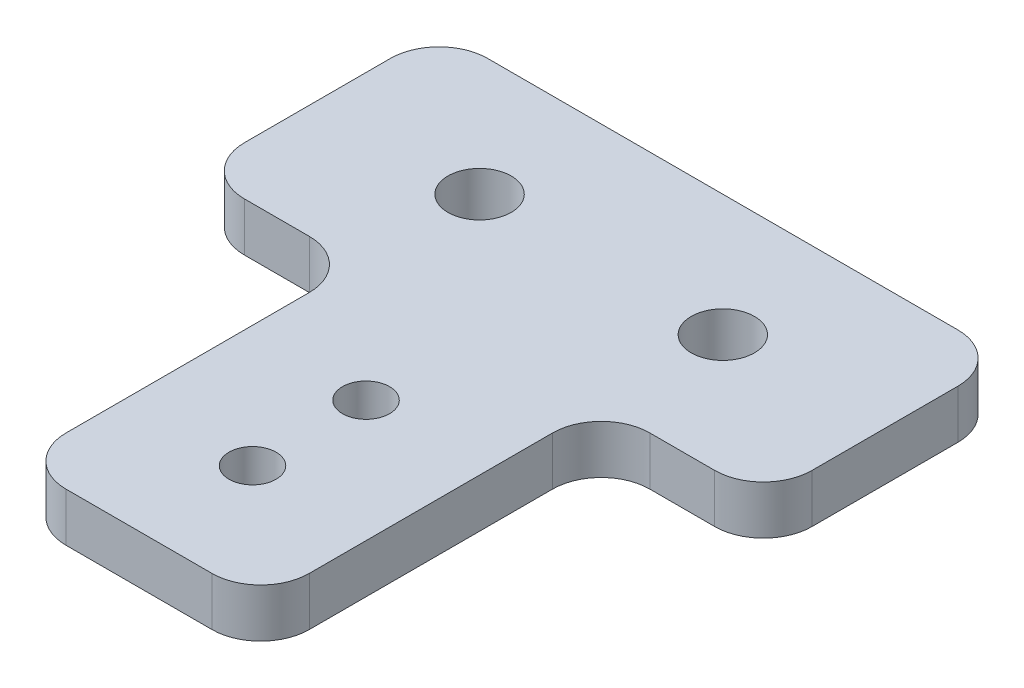
ISO-10303-21;
HEADER;
FILE_DESCRIPTION(('STEP AP214'),'2;1');
FILE_NAME('part.step','',(''),(''),'','','');
FILE_SCHEMA(('AUTOMOTIVE_DESIGN { 1 0 10303 214 1 1 1 1 }'));
ENDSEC;
DATA;
#1=APPLICATION_CONTEXT('core data for automotive mechanical design processes');
#2=APPLICATION_PROTOCOL_DEFINITION('international standard','automotive_design',2000,#1);
#3=PRODUCT_CONTEXT('',#1,'mechanical');
#4=PRODUCT('Part','Part','',(#3));
#5=PRODUCT_RELATED_PRODUCT_CATEGORY('part','',(#4));
#6=PRODUCT_DEFINITION_FORMATION('','',#4);
#7=PRODUCT_DEFINITION_CONTEXT('part definition',#1,'design');
#8=PRODUCT_DEFINITION('design','',#6,#7);
#9=PRODUCT_DEFINITION_SHAPE('','',#8);
#10=(LENGTH_UNIT() NAMED_UNIT(*) SI_UNIT(.MILLI.,.METRE.));
#11=(NAMED_UNIT(*) PLANE_ANGLE_UNIT() SI_UNIT($,.RADIAN.));
#12=(NAMED_UNIT(*) SI_UNIT($,.STERADIAN.) SOLID_ANGLE_UNIT());
#13=UNCERTAINTY_MEASURE_WITH_UNIT(LENGTH_MEASURE(1.E-05),#10,'distance_accuracy_value','');
#14=(GEOMETRIC_REPRESENTATION_CONTEXT(3) GLOBAL_UNCERTAINTY_ASSIGNED_CONTEXT((#13)) GLOBAL_UNIT_ASSIGNED_CONTEXT((#10,
#11,#12)) REPRESENTATION_CONTEXT('',''));
#15=CARTESIAN_POINT('',(0.,0.,0.));
#16=DIRECTION('',(0.,0.,1.));
#17=DIRECTION('',(1.,0.,0.));
#18=AXIS2_PLACEMENT_3D('',#15,#16,#17);
#19=CARTESIAN_POINT('',(0.,3.,0.));
#20=DIRECTION('',(0.,-1.,0.));
#21=DIRECTION('',(0.,0.,-1.));
#22=AXIS2_PLACEMENT_3D('',#19,#20,#21);
#23=PLANE('',#22);
#24=DIRECTION('',(1.,0.,0.));
#25=VECTOR('',#24,1.);
#26=CARTESIAN_POINT('',(-7.49999999999999,3.,28.5));
#27=LINE('',#26,#25);
#28=CARTESIAN_POINT('',(-4.49999999999999,3.,28.5));
#29=VERTEX_POINT('',#28);
#30=CARTESIAN_POINT('',(4.50000000000001,3.,28.5));
#31=VERTEX_POINT('',#30);
#32=EDGE_CURVE('E264',#29,#31,#27,.T.);
#33=ORIENTED_EDGE('',*,*,#32,.T.);
#34=CARTESIAN_POINT('',(4.5,3.,25.5));
#35=DIRECTION('',(0.,-1.,0.));
#36=DIRECTION('',(0.,0.,-1.));
#37=AXIS2_PLACEMENT_3D('',#34,#35,#36);
#38=CIRCLE('',#37,3.);
#39=CARTESIAN_POINT('',(7.50000000000001,3.,25.5));
#40=VERTEX_POINT('',#39);
#41=EDGE_CURVE('E212',#31,#40,#38,.F.);
#42=ORIENTED_EDGE('',*,*,#41,.T.);
#43=DIRECTION('',(0.,0.,-1.));
#44=VECTOR('',#43,1.);
#45=CARTESIAN_POINT('',(7.5,3.,7.5));
#46=LINE('',#45,#44);
#47=CARTESIAN_POINT('',(7.5,3.,10.5));
#48=VERTEX_POINT('',#47);
#49=EDGE_CURVE('E173',#40,#48,#46,.T.);
#50=ORIENTED_EDGE('',*,*,#49,.T.);
#51=CARTESIAN_POINT('',(10.5,3.,10.5));
#52=DIRECTION('',(0.,-1.,0.));
#53=DIRECTION('',(0.,0.,-1.));
#54=AXIS2_PLACEMENT_3D('',#51,#52,#53);
#55=CIRCLE('',#54,3.);
#56=CARTESIAN_POINT('',(10.5,3.,7.5));
#57=VERTEX_POINT('',#56);
#58=EDGE_CURVE('E11',#48,#57,#55,.T.);
#59=ORIENTED_EDGE('',*,*,#58,.T.);
#60=DIRECTION('',(1.,0.,0.));
#61=VECTOR('',#60,1.);
#62=CARTESIAN_POINT('',(7.5,3.,7.5));
#63=LINE('',#62,#61);
#64=CARTESIAN_POINT('',(14.5,3.,7.5));
#65=VERTEX_POINT('',#64);
#66=EDGE_CURVE('E189',#57,#65,#63,.T.);
#67=ORIENTED_EDGE('',*,*,#66,.T.);
#68=CARTESIAN_POINT('',(14.5,3.,4.5));
#69=DIRECTION('',(0.,-1.,0.));
#70=DIRECTION('',(0.,0.,-1.));
#71=AXIS2_PLACEMENT_3D('',#68,#69,#70);
#72=CIRCLE('',#71,3.);
#73=CARTESIAN_POINT('',(17.5,3.,4.5));
#74=VERTEX_POINT('',#73);
#75=EDGE_CURVE('E202',#65,#74,#72,.F.);
#76=ORIENTED_EDGE('',*,*,#75,.T.);
#77=DIRECTION('',(0.,0.,-1.));
#78=VECTOR('',#77,1.);
#79=CARTESIAN_POINT('',(17.5,3.,7.5));
#80=LINE('',#79,#78);
#81=CARTESIAN_POINT('',(17.5,3.,-4.49999999999999));
#82=VERTEX_POINT('',#81);
#83=EDGE_CURVE('E183',#74,#82,#80,.T.);
#84=ORIENTED_EDGE('',*,*,#83,.T.);
#85=CARTESIAN_POINT('',(14.5,3.,-4.5));
#86=DIRECTION('',(0.,-1.,0.));
#87=DIRECTION('',(0.,0.,-1.));
#88=AXIS2_PLACEMENT_3D('',#85,#86,#87);
#89=CIRCLE('',#88,3.);
#90=CARTESIAN_POINT('',(14.5,3.,-7.5));
#91=VERTEX_POINT('',#90);
#92=EDGE_CURVE('E204',#82,#91,#89,.F.);
#93=ORIENTED_EDGE('',*,*,#92,.T.);
#94=DIRECTION('',(-1.,0.,0.));
#95=VECTOR('',#94,1.);
#96=CARTESIAN_POINT('',(-17.5,3.,-7.5));
#97=LINE('',#96,#95);
#98=CARTESIAN_POINT('',(-14.5,3.,-7.5));
#99=VERTEX_POINT('',#98);
#100=EDGE_CURVE('E292',#91,#99,#97,.T.);
#101=ORIENTED_EDGE('',*,*,#100,.T.);
#102=CARTESIAN_POINT('',(-14.5,3.,-4.5));
#103=DIRECTION('',(0.,-1.,0.));
#104=DIRECTION('',(0.,0.,-1.));
#105=AXIS2_PLACEMENT_3D('',#102,#103,#104);
#106=CIRCLE('',#105,3.);
#107=CARTESIAN_POINT('',(-17.5,3.,-4.49999999999999));
#108=VERTEX_POINT('',#107);
#109=EDGE_CURVE('E206',#99,#108,#106,.F.);
#110=ORIENTED_EDGE('',*,*,#109,.T.);
#111=DIRECTION('',(0.,0.,1.));
#112=VECTOR('',#111,1.);
#113=CARTESIAN_POINT('',(-17.5,3.,7.5));
#114=LINE('',#113,#112);
#115=CARTESIAN_POINT('',(-17.5,3.,4.5));
#116=VERTEX_POINT('',#115);
#117=EDGE_CURVE('E289',#108,#116,#114,.T.);
#118=ORIENTED_EDGE('',*,*,#117,.T.);
#119=CARTESIAN_POINT('',(-14.5,3.,4.5));
#120=DIRECTION('',(0.,-1.,0.));
#121=DIRECTION('',(0.,0.,-1.));
#122=AXIS2_PLACEMENT_3D('',#119,#120,#121);
#123=CIRCLE('',#122,3.);
#124=CARTESIAN_POINT('',(-14.5,3.,7.5));
#125=VERTEX_POINT('',#124);
#126=EDGE_CURVE('E208',#116,#125,#123,.F.);
#127=ORIENTED_EDGE('',*,*,#126,.T.);
#128=DIRECTION('',(1.,0.,0.));
#129=VECTOR('',#128,1.);
#130=CARTESIAN_POINT('',(-17.5,3.,7.5));
#131=LINE('',#130,#129);
#132=CARTESIAN_POINT('',(-10.5,3.,7.5));
#133=VERTEX_POINT('',#132);
#134=EDGE_CURVE('E255',#125,#133,#131,.T.);
#135=ORIENTED_EDGE('',*,*,#134,.T.);
#136=CARTESIAN_POINT('',(-10.5,3.,10.5));
#137=DIRECTION('',(0.,-1.,0.));
#138=DIRECTION('',(0.,0.,-1.));
#139=AXIS2_PLACEMENT_3D('',#136,#137,#138);
#140=CIRCLE('',#139,3.);
#141=CARTESIAN_POINT('',(-7.5,3.,10.5));
#142=VERTEX_POINT('',#141);
#143=EDGE_CURVE('E245',#133,#142,#140,.T.);
#144=ORIENTED_EDGE('',*,*,#143,.T.);
#145=DIRECTION('',(0.,0.,1.));
#146=VECTOR('',#145,1.);
#147=CARTESIAN_POINT('',(-7.5,3.,7.5));
#148=LINE('',#147,#146);
#149=CARTESIAN_POINT('',(-7.5,3.,25.5));
#150=VERTEX_POINT('',#149);
#151=EDGE_CURVE('E252',#142,#150,#148,.T.);
#152=ORIENTED_EDGE('',*,*,#151,.T.);
#153=CARTESIAN_POINT('',(-4.5,3.,25.5));
#154=DIRECTION('',(0.,-1.,0.));
#155=DIRECTION('',(0.,0.,-1.));
#156=AXIS2_PLACEMENT_3D('',#153,#154,#155);
#157=CIRCLE('',#156,3.);
#158=EDGE_CURVE('E210',#150,#29,#157,.F.);
#159=ORIENTED_EDGE('',*,*,#158,.T.);
#160=EDGE_LOOP('',(#33,#42,#50,#59,#67,#76,#84,#93,#101,#110,#118,#127,#135,#144,#152,#159));
#161=FACE_BOUND('',#160,.T.);
#162=CARTESIAN_POINT('',(0.,3.,14.5));
#163=DIRECTION('',(0.,1.,0.));
#164=DIRECTION('',(0.,0.,1.));
#165=AXIS2_PLACEMENT_3D('',#162,#163,#164);
#166=CIRCLE('',#165,1.45);
#167=CARTESIAN_POINT('',(0.,3.,15.95));
#168=VERTEX_POINT('',#167);
#169=EDGE_CURVE('E284',#168,#168,#166,.T.);
#170=ORIENTED_EDGE('',*,*,#169,.F.);
#171=EDGE_LOOP('',(#170));
#172=FACE_BOUND('',#171,.T.);
#173=CARTESIAN_POINT('',(0.,3.,21.5));
#174=DIRECTION('',(0.,1.,0.));
#175=DIRECTION('',(0.,0.,1.));
#176=AXIS2_PLACEMENT_3D('',#173,#174,#175);
#177=CIRCLE('',#176,1.45);
#178=CARTESIAN_POINT('',(0.,3.,22.95));
#179=VERTEX_POINT('',#178);
#180=EDGE_CURVE('E300',#179,#179,#177,.T.);
#181=ORIENTED_EDGE('',*,*,#180,.F.);
#182=EDGE_LOOP('',(#181));
#183=FACE_BOUND('',#182,.T.);
#184=CARTESIAN_POINT('',(-7.5,3.,0.));
#185=DIRECTION('',(0.,1.,0.));
#186=DIRECTION('',(0.,0.,1.));
#187=AXIS2_PLACEMENT_3D('',#184,#185,#186);
#188=CIRCLE('',#187,1.95);
#189=CARTESIAN_POINT('',(-7.5,3.,1.95));
#190=VERTEX_POINT('',#189);
#191=EDGE_CURVE('E306',#190,#190,#188,.T.);
#192=ORIENTED_EDGE('',*,*,#191,.F.);
#193=EDGE_LOOP('',(#192));
#194=FACE_BOUND('',#193,.T.);
#195=CARTESIAN_POINT('',(7.5,3.,0.));
#196=DIRECTION('',(0.,1.,0.));
#197=DIRECTION('',(0.,0.,-1.));
#198=AXIS2_PLACEMENT_3D('',#195,#196,#197);
#199=CIRCLE('',#198,1.95);
#200=CARTESIAN_POINT('',(7.5,3.,-1.95));
#201=VERTEX_POINT('',#200);
#202=EDGE_CURVE('E312',#201,#201,#199,.T.);
#203=ORIENTED_EDGE('',*,*,#202,.F.);
#204=EDGE_LOOP('',(#203));
#205=FACE_BOUND('',#204,.T.);
#206=ADVANCED_FACE('F41',(#161,#172,#183,#194,#205),#23,.F.);
#207=CARTESIAN_POINT('',(0.,0.,0.));
#208=DIRECTION('',(0.,-1.,0.));
#209=DIRECTION('',(0.,0.,-1.));
#210=AXIS2_PLACEMENT_3D('',#207,#208,#209);
#211=PLANE('',#210);
#212=CARTESIAN_POINT('',(-7.5,0.,0.));
#213=DIRECTION('',(0.,1.,0.));
#214=DIRECTION('',(0.,0.,1.));
#215=AXIS2_PLACEMENT_3D('',#212,#213,#214);
#216=CIRCLE('',#215,1.95);
#217=CARTESIAN_POINT('',(-7.5,0.,1.95));
#218=VERTEX_POINT('',#217);
#219=EDGE_CURVE('E309',#218,#218,#216,.T.);
#220=ORIENTED_EDGE('',*,*,#219,.T.);
#221=EDGE_LOOP('',(#220));
#222=FACE_BOUND('',#221,.T.);
#223=CARTESIAN_POINT('',(0.,0.,14.5));
#224=DIRECTION('',(0.,1.,0.));
#225=DIRECTION('',(0.,0.,1.));
#226=AXIS2_PLACEMENT_3D('',#223,#224,#225);
#227=CIRCLE('',#226,1.45);
#228=CARTESIAN_POINT('',(0.,0.,15.95));
#229=VERTEX_POINT('',#228);
#230=EDGE_CURVE('E297',#229,#229,#227,.T.);
#231=ORIENTED_EDGE('',*,*,#230,.T.);
#232=EDGE_LOOP('',(#231));
#233=FACE_BOUND('',#232,.T.);
#234=DIRECTION('',(0.,0.,-1.));
#235=VECTOR('',#234,1.);
#236=CARTESIAN_POINT('',(7.5,0.,7.5));
#237=LINE('',#236,#235);
#238=CARTESIAN_POINT('',(7.50000000000001,0.,25.5));
#239=VERTEX_POINT('',#238);
#240=CARTESIAN_POINT('',(7.5,0.,10.5));
#241=VERTEX_POINT('',#240);
#242=EDGE_CURVE('E171',#239,#241,#237,.T.);
#243=ORIENTED_EDGE('',*,*,#242,.F.);
#244=CARTESIAN_POINT('',(4.5,0.,25.5));
#245=DIRECTION('',(0.,-1.,0.));
#246=DIRECTION('',(0.,0.,-1.));
#247=AXIS2_PLACEMENT_3D('',#244,#245,#246);
#248=CIRCLE('',#247,3.);
#249=CARTESIAN_POINT('',(4.50000000000001,0.,28.5));
#250=VERTEX_POINT('',#249);
#251=EDGE_CURVE('E154',#239,#250,#248,.T.);
#252=ORIENTED_EDGE('',*,*,#251,.T.);
#253=DIRECTION('',(1.,0.,0.));
#254=VECTOR('',#253,1.);
#255=CARTESIAN_POINT('',(-7.49999999999999,0.,28.5));
#256=LINE('',#255,#254);
#257=CARTESIAN_POINT('',(-4.49999999999999,0.,28.5));
#258=VERTEX_POINT('',#257);
#259=EDGE_CURVE('E181',#258,#250,#256,.T.);
#260=ORIENTED_EDGE('',*,*,#259,.F.);
#261=CARTESIAN_POINT('',(-4.5,0.,25.5));
#262=DIRECTION('',(0.,-1.,0.));
#263=DIRECTION('',(0.,0.,-1.));
#264=AXIS2_PLACEMENT_3D('',#261,#262,#263);
#265=CIRCLE('',#264,3.);
#266=CARTESIAN_POINT('',(-7.5,0.,25.5));
#267=VERTEX_POINT('',#266);
#268=EDGE_CURVE('E165',#258,#267,#265,.T.);
#269=ORIENTED_EDGE('',*,*,#268,.T.);
#270=DIRECTION('',(0.,0.,1.));
#271=VECTOR('',#270,1.);
#272=CARTESIAN_POINT('',(-7.5,0.,7.5));
#273=LINE('',#272,#271);
#274=CARTESIAN_POINT('',(-7.5,0.,10.5));
#275=VERTEX_POINT('',#274);
#276=EDGE_CURVE('E185',#275,#267,#273,.T.);
#277=ORIENTED_EDGE('',*,*,#276,.F.);
#278=CARTESIAN_POINT('',(-10.5,0.,10.5));
#279=DIRECTION('',(0.,-1.,0.));
#280=DIRECTION('',(0.,0.,-1.));
#281=AXIS2_PLACEMENT_3D('',#278,#279,#280);
#282=CIRCLE('',#281,3.);
#283=CARTESIAN_POINT('',(-10.5,0.,7.5));
#284=VERTEX_POINT('',#283);
#285=EDGE_CURVE('E243',#275,#284,#282,.F.);
#286=ORIENTED_EDGE('',*,*,#285,.T.);
#287=DIRECTION('',(1.,0.,0.));
#288=VECTOR('',#287,1.);
#289=CARTESIAN_POINT('',(-17.5,0.,7.5));
#290=LINE('',#289,#288);
#291=CARTESIAN_POINT('',(-14.5,0.,7.5));
#292=VERTEX_POINT('',#291);
#293=EDGE_CURVE('E269',#292,#284,#290,.T.);
#294=ORIENTED_EDGE('',*,*,#293,.F.);
#295=CARTESIAN_POINT('',(-14.5,0.,4.5));
#296=DIRECTION('',(0.,-1.,0.));
#297=DIRECTION('',(0.,0.,-1.));
#298=AXIS2_PLACEMENT_3D('',#295,#296,#297);
#299=CIRCLE('',#298,3.);
#300=CARTESIAN_POINT('',(-17.5,0.,4.5));
#301=VERTEX_POINT('',#300);
#302=EDGE_CURVE('E196',#292,#301,#299,.T.);
#303=ORIENTED_EDGE('',*,*,#302,.T.);
#304=DIRECTION('',(0.,0.,1.));
#305=VECTOR('',#304,1.);
#306=CARTESIAN_POINT('',(-17.5,0.,7.5));
#307=LINE('',#306,#305);
#308=CARTESIAN_POINT('',(-17.5,0.,-4.49999999999999));
#309=VERTEX_POINT('',#308);
#310=EDGE_CURVE('E273',#309,#301,#307,.T.);
#311=ORIENTED_EDGE('',*,*,#310,.F.);
#312=CARTESIAN_POINT('',(-14.5,0.,-4.5));
#313=DIRECTION('',(0.,-1.,0.));
#314=DIRECTION('',(0.,0.,-1.));
#315=AXIS2_PLACEMENT_3D('',#312,#313,#314);
#316=CIRCLE('',#315,3.);
#317=CARTESIAN_POINT('',(-14.5,0.,-7.5));
#318=VERTEX_POINT('',#317);
#319=EDGE_CURVE('E194',#309,#318,#316,.T.);
#320=ORIENTED_EDGE('',*,*,#319,.T.);
#321=DIRECTION('',(-1.,0.,0.));
#322=VECTOR('',#321,1.);
#323=CARTESIAN_POINT('',(-17.5,0.,-7.5));
#324=LINE('',#323,#322);
#325=CARTESIAN_POINT('',(14.5,0.,-7.5));
#326=VERTEX_POINT('',#325);
#327=EDGE_CURVE('E276',#326,#318,#324,.T.);
#328=ORIENTED_EDGE('',*,*,#327,.F.);
#329=CARTESIAN_POINT('',(14.5,0.,-4.5));
#330=DIRECTION('',(0.,-1.,0.));
#331=DIRECTION('',(0.,0.,-1.));
#332=AXIS2_PLACEMENT_3D('',#329,#330,#331);
#333=CIRCLE('',#332,3.);
#334=CARTESIAN_POINT('',(17.5,0.,-4.49999999999999));
#335=VERTEX_POINT('',#334);
#336=EDGE_CURVE('E192',#326,#335,#333,.T.);
#337=ORIENTED_EDGE('',*,*,#336,.T.);
#338=DIRECTION('',(0.,0.,-1.));
#339=VECTOR('',#338,1.);
#340=CARTESIAN_POINT('',(17.5,0.,7.5));
#341=LINE('',#340,#339);
#342=CARTESIAN_POINT('',(17.5,0.,4.5));
#343=VERTEX_POINT('',#342);
#344=EDGE_CURVE('E281',#343,#335,#341,.T.);
#345=ORIENTED_EDGE('',*,*,#344,.F.);
#346=CARTESIAN_POINT('',(14.5,0.,4.5));
#347=DIRECTION('',(0.,-1.,0.));
#348=DIRECTION('',(0.,0.,-1.));
#349=AXIS2_PLACEMENT_3D('',#346,#347,#348);
#350=CIRCLE('',#349,3.);
#351=CARTESIAN_POINT('',(14.5,0.,7.5));
#352=VERTEX_POINT('',#351);
#353=EDGE_CURVE('E174',#343,#352,#350,.T.);
#354=ORIENTED_EDGE('',*,*,#353,.T.);
#355=DIRECTION('',(1.,0.,0.));
#356=VECTOR('',#355,1.);
#357=CARTESIAN_POINT('',(7.5,0.,7.5));
#358=LINE('',#357,#356);
#359=CARTESIAN_POINT('',(10.5,0.,7.5));
#360=VERTEX_POINT('',#359);
#361=EDGE_CURVE('E180',#360,#352,#358,.T.);
#362=ORIENTED_EDGE('',*,*,#361,.F.);
#363=CARTESIAN_POINT('',(10.5,0.,10.5));
#364=DIRECTION('',(0.,-1.,0.));
#365=DIRECTION('',(0.,0.,-1.));
#366=AXIS2_PLACEMENT_3D('',#363,#364,#365);
#367=CIRCLE('',#366,3.);
#368=EDGE_CURVE('E49',#360,#241,#367,.F.);
#369=ORIENTED_EDGE('',*,*,#368,.T.);
#370=EDGE_LOOP('',(#243,#252,#260,#269,#277,#286,#294,#303,#311,#320,#328,#337,#345,#354,#362,#369));
#371=FACE_BOUND('',#370,.T.);
#372=CARTESIAN_POINT('',(0.,0.,21.5));
#373=DIRECTION('',(0.,1.,0.));
#374=DIRECTION('',(0.,0.,1.));
#375=AXIS2_PLACEMENT_3D('',#372,#373,#374);
#376=CIRCLE('',#375,1.45);
#377=CARTESIAN_POINT('',(0.,0.,22.95));
#378=VERTEX_POINT('',#377);
#379=EDGE_CURVE('E303',#378,#378,#376,.T.);
#380=ORIENTED_EDGE('',*,*,#379,.T.);
#381=EDGE_LOOP('',(#380));
#382=FACE_BOUND('',#381,.T.);
#383=CARTESIAN_POINT('',(7.5,0.,0.));
#384=DIRECTION('',(0.,1.,0.));
#385=DIRECTION('',(0.,0.,-1.));
#386=AXIS2_PLACEMENT_3D('',#383,#384,#385);
#387=CIRCLE('',#386,1.95);
#388=CARTESIAN_POINT('',(7.5,0.,-1.95));
#389=VERTEX_POINT('',#388);
#390=EDGE_CURVE('E315',#389,#389,#387,.T.);
#391=ORIENTED_EDGE('',*,*,#390,.T.);
#392=EDGE_LOOP('',(#391));
#393=FACE_BOUND('',#392,.T.);
#394=ADVANCED_FACE('F177',(#222,#233,#371,#382,#393),#211,.T.);
#395=CARTESIAN_POINT('',(17.5,3.,7.5));
#396=DIRECTION('',(-1.,0.,0.));
#397=DIRECTION('',(0.,0.,1.));
#398=AXIS2_PLACEMENT_3D('',#395,#396,#397);
#399=PLANE('',#398);
#400=ORIENTED_EDGE('',*,*,#344,.T.);
#401=DIRECTION('',(0.,-1.,0.));
#402=VECTOR('',#401,1.);
#403=CARTESIAN_POINT('',(17.5,3.,-4.5));
#404=LINE('',#403,#402);
#405=EDGE_CURVE('E237',#335,#82,#404,.F.);
#406=ORIENTED_EDGE('',*,*,#405,.T.);
#407=ORIENTED_EDGE('',*,*,#83,.F.);
#408=DIRECTION('',(0.,-1.,0.));
#409=VECTOR('',#408,1.);
#410=CARTESIAN_POINT('',(17.5,3.,4.5));
#411=LINE('',#410,#409);
#412=EDGE_CURVE('E234',#74,#343,#411,.T.);
#413=ORIENTED_EDGE('',*,*,#412,.T.);
#414=EDGE_LOOP('',(#400,#406,#407,#413));
#415=FACE_BOUND('',#414,.T.);
#416=ADVANCED_FACE('F330',(#415),#399,.F.);
#417=CARTESIAN_POINT('',(-17.5,3.,-7.5));
#418=DIRECTION('',(0.,0.,1.));
#419=DIRECTION('',(1.,0.,0.));
#420=AXIS2_PLACEMENT_3D('',#417,#418,#419);
#421=PLANE('',#420);
#422=ORIENTED_EDGE('',*,*,#327,.T.);
#423=DIRECTION('',(0.,-1.,0.));
#424=VECTOR('',#423,1.);
#425=CARTESIAN_POINT('',(-14.5,3.,-7.5));
#426=LINE('',#425,#424);
#427=EDGE_CURVE('E232',#318,#99,#426,.F.);
#428=ORIENTED_EDGE('',*,*,#427,.T.);
#429=ORIENTED_EDGE('',*,*,#100,.F.);
#430=DIRECTION('',(0.,-1.,0.));
#431=VECTOR('',#430,1.);
#432=CARTESIAN_POINT('',(14.5,3.,-7.5));
#433=LINE('',#432,#431);
#434=EDGE_CURVE('E229',#91,#326,#433,.T.);
#435=ORIENTED_EDGE('',*,*,#434,.T.);
#436=EDGE_LOOP('',(#422,#428,#429,#435));
#437=FACE_BOUND('',#436,.T.);
#438=ADVANCED_FACE('F353',(#437),#421,.F.);
#439=CARTESIAN_POINT('',(-17.5,3.,7.5));
#440=DIRECTION('',(1.,0.,0.));
#441=DIRECTION('',(0.,0.,-1.));
#442=AXIS2_PLACEMENT_3D('',#439,#440,#441);
#443=PLANE('',#442);
#444=ORIENTED_EDGE('',*,*,#310,.T.);
#445=DIRECTION('',(0.,-1.,0.));
#446=VECTOR('',#445,1.);
#447=CARTESIAN_POINT('',(-17.5,3.,4.5));
#448=LINE('',#447,#446);
#449=EDGE_CURVE('E227',#301,#116,#448,.F.);
#450=ORIENTED_EDGE('',*,*,#449,.T.);
#451=ORIENTED_EDGE('',*,*,#117,.F.);
#452=DIRECTION('',(0.,-1.,0.));
#453=VECTOR('',#452,1.);
#454=CARTESIAN_POINT('',(-17.5,3.,-4.5));
#455=LINE('',#454,#453);
#456=EDGE_CURVE('E224',#108,#309,#455,.T.);
#457=ORIENTED_EDGE('',*,*,#456,.T.);
#458=EDGE_LOOP('',(#444,#450,#451,#457));
#459=FACE_BOUND('',#458,.T.);
#460=ADVANCED_FACE('F350',(#459),#443,.F.);
#461=CARTESIAN_POINT('',(-17.5,3.,7.5));
#462=DIRECTION('',(0.,0.,-1.));
#463=DIRECTION('',(-1.,0.,0.));
#464=AXIS2_PLACEMENT_3D('',#461,#462,#463);
#465=PLANE('',#464);
#466=ORIENTED_EDGE('',*,*,#293,.T.);
#467=DIRECTION('',(0.,-1.,0.));
#468=VECTOR('',#467,1.);
#469=CARTESIAN_POINT('',(-10.5,3.,7.5));
#470=LINE('',#469,#468);
#471=EDGE_CURVE('E222',#284,#133,#470,.F.);
#472=ORIENTED_EDGE('',*,*,#471,.T.);
#473=ORIENTED_EDGE('',*,*,#134,.F.);
#474=DIRECTION('',(0.,-1.,0.));
#475=VECTOR('',#474,1.);
#476=CARTESIAN_POINT('',(-14.5,3.,7.5));
#477=LINE('',#476,#475);
#478=EDGE_CURVE('E219',#125,#292,#477,.T.);
#479=ORIENTED_EDGE('',*,*,#478,.T.);
#480=EDGE_LOOP('',(#466,#472,#473,#479));
#481=FACE_BOUND('',#480,.T.);
#482=ADVANCED_FACE('F271',(#481),#465,.F.);
#483=CARTESIAN_POINT('',(-7.5,3.,7.5));
#484=DIRECTION('',(1.,0.,0.));
#485=DIRECTION('',(0.,0.,-1.));
#486=AXIS2_PLACEMENT_3D('',#483,#484,#485);
#487=PLANE('',#486);
#488=ORIENTED_EDGE('',*,*,#276,.T.);
#489=DIRECTION('',(0.,-1.,0.));
#490=VECTOR('',#489,1.);
#491=CARTESIAN_POINT('',(-7.5,3.,25.5));
#492=LINE('',#491,#490);
#493=EDGE_CURVE('E217',#267,#150,#492,.F.);
#494=ORIENTED_EDGE('',*,*,#493,.T.);
#495=ORIENTED_EDGE('',*,*,#151,.F.);
#496=DIRECTION('',(0.,-1.,0.));
#497=VECTOR('',#496,1.);
#498=CARTESIAN_POINT('',(-7.5,0.,10.5));
#499=LINE('',#498,#497);
#500=EDGE_CURVE('E214',#142,#275,#499,.T.);
#501=ORIENTED_EDGE('',*,*,#500,.T.);
#502=EDGE_LOOP('',(#488,#494,#495,#501));
#503=FACE_BOUND('',#502,.T.);
#504=ADVANCED_FACE('F261',(#503),#487,.F.);
#505=CARTESIAN_POINT('',(-7.49999999999999,3.,28.5));
#506=DIRECTION('',(0.,0.,-1.));
#507=DIRECTION('',(-1.,0.,0.));
#508=AXIS2_PLACEMENT_3D('',#505,#506,#507);
#509=PLANE('',#508);
#510=ORIENTED_EDGE('',*,*,#259,.T.);
#511=DIRECTION('',(0.,-1.,0.));
#512=VECTOR('',#511,1.);
#513=CARTESIAN_POINT('',(4.50000000000001,3.,28.5));
#514=LINE('',#513,#512);
#515=EDGE_CURVE('E159',#250,#31,#514,.F.);
#516=ORIENTED_EDGE('',*,*,#515,.T.);
#517=ORIENTED_EDGE('',*,*,#32,.F.);
#518=DIRECTION('',(0.,-1.,0.));
#519=VECTOR('',#518,1.);
#520=CARTESIAN_POINT('',(-4.49999999999999,3.,28.5));
#521=LINE('',#520,#519);
#522=EDGE_CURVE('E164',#29,#258,#521,.T.);
#523=ORIENTED_EDGE('',*,*,#522,.T.);
#524=EDGE_LOOP('',(#510,#516,#517,#523));
#525=FACE_BOUND('',#524,.T.);
#526=ADVANCED_FACE('F342',(#525),#509,.F.);
#527=CARTESIAN_POINT('',(7.5,3.,7.5));
#528=DIRECTION('',(-1.,0.,0.));
#529=DIRECTION('',(0.,0.,1.));
#530=AXIS2_PLACEMENT_3D('',#527,#528,#529);
#531=PLANE('',#530);
#532=ORIENTED_EDGE('',*,*,#49,.F.);
#533=DIRECTION('',(0.,-1.,0.));
#534=VECTOR('',#533,1.);
#535=CARTESIAN_POINT('',(7.50000000000001,3.,25.5));
#536=LINE('',#535,#534);
#537=EDGE_CURVE('E158',#40,#239,#536,.T.);
#538=ORIENTED_EDGE('',*,*,#537,.T.);
#539=ORIENTED_EDGE('',*,*,#242,.T.);
#540=DIRECTION('',(0.,-1.,0.));
#541=VECTOR('',#540,1.);
#542=CARTESIAN_POINT('',(7.5,3.,10.5));
#543=LINE('',#542,#541);
#544=EDGE_CURVE('E175',#241,#48,#543,.F.);
#545=ORIENTED_EDGE('',*,*,#544,.T.);
#546=EDGE_LOOP('',(#532,#538,#539,#545));
#547=FACE_BOUND('',#546,.T.);
#548=ADVANCED_FACE('F170',(#547),#531,.F.);
#549=CARTESIAN_POINT('',(7.5,3.,7.5));
#550=DIRECTION('',(0.,0.,-1.));
#551=DIRECTION('',(-1.,0.,0.));
#552=AXIS2_PLACEMENT_3D('',#549,#550,#551);
#553=PLANE('',#552);
#554=ORIENTED_EDGE('',*,*,#361,.T.);
#555=DIRECTION('',(0.,-1.,0.));
#556=VECTOR('',#555,1.);
#557=CARTESIAN_POINT('',(14.5,3.,7.5));
#558=LINE('',#557,#556);
#559=EDGE_CURVE('E56',#352,#65,#558,.F.);
#560=ORIENTED_EDGE('',*,*,#559,.T.);
#561=ORIENTED_EDGE('',*,*,#66,.F.);
#562=DIRECTION('',(0.,-1.,0.));
#563=VECTOR('',#562,1.);
#564=CARTESIAN_POINT('',(10.5,0.,7.5));
#565=LINE('',#564,#563);
#566=EDGE_CURVE('E239',#57,#360,#565,.T.);
#567=ORIENTED_EDGE('',*,*,#566,.T.);
#568=EDGE_LOOP('',(#554,#560,#561,#567));
#569=FACE_BOUND('',#568,.T.);
#570=ADVANCED_FACE('F337',(#569),#553,.F.);
#571=CARTESIAN_POINT('',(0.,3.,14.5));
#572=DIRECTION('',(0.,-1.,0.));
#573=DIRECTION('',(0.,0.,-1.));
#574=AXIS2_PLACEMENT_3D('',#571,#572,#573);
#575=CYLINDRICAL_SURFACE('',#574,1.45);
#576=ORIENTED_EDGE('',*,*,#169,.T.);
#577=EDGE_LOOP('',(#576));
#578=FACE_BOUND('',#577,.T.);
#579=ORIENTED_EDGE('',*,*,#230,.F.);
#580=EDGE_LOOP('',(#579));
#581=FACE_BOUND('',#580,.T.);
#582=ADVANCED_FACE('F334',(#578,#581),#575,.F.);
#583=CARTESIAN_POINT('',(0.,3.,21.5));
#584=DIRECTION('',(0.,-1.,0.));
#585=DIRECTION('',(0.,0.,-1.));
#586=AXIS2_PLACEMENT_3D('',#583,#584,#585);
#587=CYLINDRICAL_SURFACE('',#586,1.45);
#588=ORIENTED_EDGE('',*,*,#180,.T.);
#589=EDGE_LOOP('',(#588));
#590=FACE_BOUND('',#589,.T.);
#591=ORIENTED_EDGE('',*,*,#379,.F.);
#592=EDGE_LOOP('',(#591));
#593=FACE_BOUND('',#592,.T.);
#594=ADVANCED_FACE('F466',(#590,#593),#587,.F.);
#595=CARTESIAN_POINT('',(-7.5,3.,0.));
#596=DIRECTION('',(0.,-1.,0.));
#597=DIRECTION('',(0.,0.,-1.));
#598=AXIS2_PLACEMENT_3D('',#595,#596,#597);
#599=CYLINDRICAL_SURFACE('',#598,1.95);
#600=ORIENTED_EDGE('',*,*,#191,.T.);
#601=EDGE_LOOP('',(#600));
#602=FACE_BOUND('',#601,.T.);
#603=ORIENTED_EDGE('',*,*,#219,.F.);
#604=EDGE_LOOP('',(#603));
#605=FACE_BOUND('',#604,.T.);
#606=ADVANCED_FACE('F457',(#602,#605),#599,.F.);
#607=CARTESIAN_POINT('',(7.5,3.,0.));
#608=DIRECTION('',(0.,-1.,0.));
#609=DIRECTION('',(0.,0.,-1.));
#610=AXIS2_PLACEMENT_3D('',#607,#608,#609);
#611=CYLINDRICAL_SURFACE('',#610,1.95);
#612=ORIENTED_EDGE('',*,*,#202,.T.);
#613=EDGE_LOOP('',(#612));
#614=FACE_BOUND('',#613,.T.);
#615=ORIENTED_EDGE('',*,*,#390,.F.);
#616=EDGE_LOOP('',(#615));
#617=FACE_BOUND('',#616,.T.);
#618=ADVANCED_FACE('F321',(#614,#617),#611,.F.);
#619=CARTESIAN_POINT('',(4.5,3.,25.5));
#620=DIRECTION('',(0.,-1.,0.));
#621=DIRECTION('',(0.,0.,-1.));
#622=AXIS2_PLACEMENT_3D('',#619,#620,#621);
#623=CYLINDRICAL_SURFACE('',#622,3.);
#624=ORIENTED_EDGE('',*,*,#41,.F.);
#625=ORIENTED_EDGE('',*,*,#515,.F.);
#626=ORIENTED_EDGE('',*,*,#251,.F.);
#627=ORIENTED_EDGE('',*,*,#537,.F.);
#628=EDGE_LOOP('',(#624,#625,#626,#627));
#629=FACE_BOUND('',#628,.T.);
#630=ADVANCED_FACE('F157',(#629),#623,.T.);
#631=CARTESIAN_POINT('',(-4.5,3.,25.5));
#632=DIRECTION('',(0.,-1.,0.));
#633=DIRECTION('',(0.,0.,-1.));
#634=AXIS2_PLACEMENT_3D('',#631,#632,#633);
#635=CYLINDRICAL_SURFACE('',#634,3.);
#636=ORIENTED_EDGE('',*,*,#158,.F.);
#637=ORIENTED_EDGE('',*,*,#493,.F.);
#638=ORIENTED_EDGE('',*,*,#268,.F.);
#639=ORIENTED_EDGE('',*,*,#522,.F.);
#640=EDGE_LOOP('',(#636,#637,#638,#639));
#641=FACE_BOUND('',#640,.T.);
#642=ADVANCED_FACE('F363',(#641),#635,.T.);
#643=CARTESIAN_POINT('',(-10.5,3.,10.5));
#644=DIRECTION('',(0.,1.,0.));
#645=DIRECTION('',(0.,0.,1.));
#646=AXIS2_PLACEMENT_3D('',#643,#644,#645);
#647=CYLINDRICAL_SURFACE('',#646,3.);
#648=ORIENTED_EDGE('',*,*,#143,.F.);
#649=ORIENTED_EDGE('',*,*,#471,.F.);
#650=ORIENTED_EDGE('',*,*,#285,.F.);
#651=ORIENTED_EDGE('',*,*,#500,.F.);
#652=EDGE_LOOP('',(#648,#649,#650,#651));
#653=FACE_BOUND('',#652,.T.);
#654=ADVANCED_FACE('F266',(#653),#647,.F.);
#655=CARTESIAN_POINT('',(-14.5,3.,4.5));
#656=DIRECTION('',(0.,-1.,0.));
#657=DIRECTION('',(0.,0.,-1.));
#658=AXIS2_PLACEMENT_3D('',#655,#656,#657);
#659=CYLINDRICAL_SURFACE('',#658,3.);
#660=ORIENTED_EDGE('',*,*,#126,.F.);
#661=ORIENTED_EDGE('',*,*,#449,.F.);
#662=ORIENTED_EDGE('',*,*,#302,.F.);
#663=ORIENTED_EDGE('',*,*,#478,.F.);
#664=EDGE_LOOP('',(#660,#661,#662,#663));
#665=FACE_BOUND('',#664,.T.);
#666=ADVANCED_FACE('F369',(#665),#659,.T.);
#667=CARTESIAN_POINT('',(-14.5,3.,-4.5));
#668=DIRECTION('',(0.,-1.,0.));
#669=DIRECTION('',(0.,0.,-1.));
#670=AXIS2_PLACEMENT_3D('',#667,#668,#669);
#671=CYLINDRICAL_SURFACE('',#670,3.);
#672=ORIENTED_EDGE('',*,*,#109,.F.);
#673=ORIENTED_EDGE('',*,*,#427,.F.);
#674=ORIENTED_EDGE('',*,*,#319,.F.);
#675=ORIENTED_EDGE('',*,*,#456,.F.);
#676=EDGE_LOOP('',(#672,#673,#674,#675));
#677=FACE_BOUND('',#676,.T.);
#678=ADVANCED_FACE('F372',(#677),#671,.T.);
#679=CARTESIAN_POINT('',(14.5,3.,-4.5));
#680=DIRECTION('',(0.,-1.,0.));
#681=DIRECTION('',(0.,0.,-1.));
#682=AXIS2_PLACEMENT_3D('',#679,#680,#681);
#683=CYLINDRICAL_SURFACE('',#682,3.);
#684=ORIENTED_EDGE('',*,*,#92,.F.);
#685=ORIENTED_EDGE('',*,*,#405,.F.);
#686=ORIENTED_EDGE('',*,*,#336,.F.);
#687=ORIENTED_EDGE('',*,*,#434,.F.);
#688=EDGE_LOOP('',(#684,#685,#686,#687));
#689=FACE_BOUND('',#688,.T.);
#690=ADVANCED_FACE('F376',(#689),#683,.T.);
#691=CARTESIAN_POINT('',(14.5,3.,4.5));
#692=DIRECTION('',(0.,-1.,0.));
#693=DIRECTION('',(0.,0.,-1.));
#694=AXIS2_PLACEMENT_3D('',#691,#692,#693);
#695=CYLINDRICAL_SURFACE('',#694,3.);
#696=ORIENTED_EDGE('',*,*,#75,.F.);
#697=ORIENTED_EDGE('',*,*,#559,.F.);
#698=ORIENTED_EDGE('',*,*,#353,.F.);
#699=ORIENTED_EDGE('',*,*,#412,.F.);
#700=EDGE_LOOP('',(#696,#697,#698,#699));
#701=FACE_BOUND('',#700,.T.);
#702=ADVANCED_FACE('F379',(#701),#695,.T.);
#703=CARTESIAN_POINT('',(10.5,3.,10.5));
#704=DIRECTION('',(0.,1.,0.));
#705=DIRECTION('',(0.,0.,1.));
#706=AXIS2_PLACEMENT_3D('',#703,#704,#705);
#707=CYLINDRICAL_SURFACE('',#706,3.);
#708=ORIENTED_EDGE('',*,*,#58,.F.);
#709=ORIENTED_EDGE('',*,*,#544,.F.);
#710=ORIENTED_EDGE('',*,*,#368,.F.);
#711=ORIENTED_EDGE('',*,*,#566,.F.);
#712=EDGE_LOOP('',(#708,#709,#710,#711));
#713=FACE_BOUND('',#712,.T.);
#714=ADVANCED_FACE('F43',(#713),#707,.F.);
#715=CLOSED_SHELL('',(#206,#394,#416,#438,#460,#482,#504,#526,#548,#570,#582,#594,#606,#618,
#630,#642,#654,#666,#678,#690,#702,#714));
#716=MANIFOLD_SOLID_BREP('B2',#715);
#717=ADVANCED_BREP_SHAPE_REPRESENTATION('',(#18,#716),#14);
#718=SHAPE_DEFINITION_REPRESENTATION(#9,#717);
ENDSEC;
END-ISO-10303-21;
